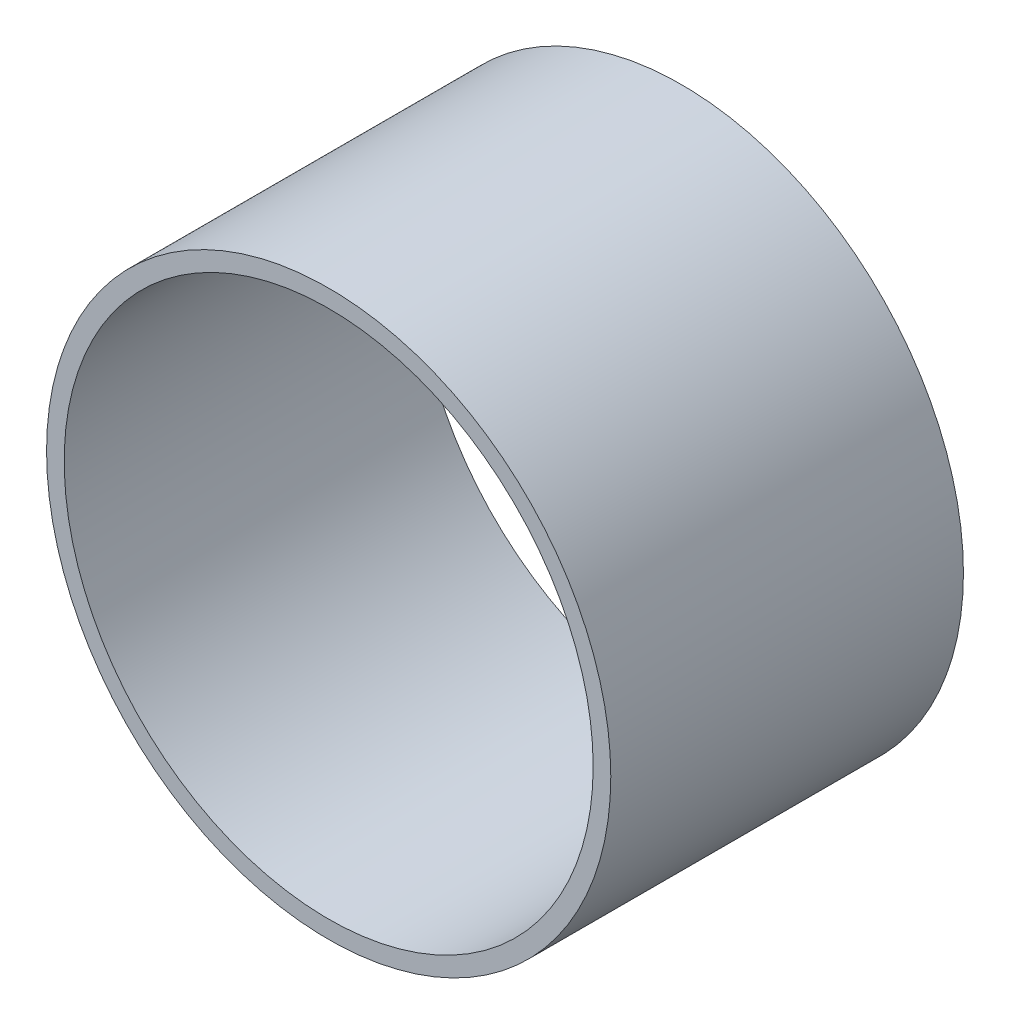
ISO-10303-21;
HEADER;
FILE_DESCRIPTION(('STEP AP214'),'2;1');
FILE_NAME('part.step','',(''),(''),'','','');
FILE_SCHEMA(('AUTOMOTIVE_DESIGN { 1 0 10303 214 1 1 1 1 }'));
ENDSEC;
DATA;
#1=APPLICATION_CONTEXT('core data for automotive mechanical design processes');
#2=APPLICATION_PROTOCOL_DEFINITION('international standard','automotive_design',2000,#1);
#3=PRODUCT_CONTEXT('',#1,'mechanical');
#4=PRODUCT('Part','Part','',(#3));
#5=PRODUCT_RELATED_PRODUCT_CATEGORY('part','',(#4));
#6=PRODUCT_DEFINITION_FORMATION('','',#4);
#7=PRODUCT_DEFINITION_CONTEXT('part definition',#1,'design');
#8=PRODUCT_DEFINITION('design','',#6,#7);
#9=PRODUCT_DEFINITION_SHAPE('','',#8);
#10=(LENGTH_UNIT() NAMED_UNIT(*) SI_UNIT(.MILLI.,.METRE.));
#11=(NAMED_UNIT(*) PLANE_ANGLE_UNIT() SI_UNIT($,.RADIAN.));
#12=(NAMED_UNIT(*) SI_UNIT($,.STERADIAN.) SOLID_ANGLE_UNIT());
#13=UNCERTAINTY_MEASURE_WITH_UNIT(LENGTH_MEASURE(1.E-05),#10,'distance_accuracy_value','');
#14=(GEOMETRIC_REPRESENTATION_CONTEXT(3) GLOBAL_UNCERTAINTY_ASSIGNED_CONTEXT((#13)) GLOBAL_UNIT_ASSIGNED_CONTEXT((#10,
#11,#12)) REPRESENTATION_CONTEXT('',''));
#15=CARTESIAN_POINT('',(0.,0.,0.));
#16=DIRECTION('',(0.,0.,1.));
#17=DIRECTION('',(1.,0.,0.));
#18=AXIS2_PLACEMENT_3D('',#15,#16,#17);
#19=CARTESIAN_POINT('',(0.,0.,-136.));
#20=DIRECTION('',(0.,0.,1.));
#21=DIRECTION('',(1.,0.,0.));
#22=AXIS2_PLACEMENT_3D('',#19,#20,#21);
#23=CYLINDRICAL_SURFACE('',#22,45.);
#24=CARTESIAN_POINT('',(0.,0.,-201.));
#25=DIRECTION('',(0.,0.,1.));
#26=DIRECTION('',(1.,0.,0.));
#27=AXIS2_PLACEMENT_3D('',#24,#25,#26);
#28=CIRCLE('',#27,45.);
#29=CARTESIAN_POINT('',(45.,0.,-201.));
#30=VERTEX_POINT('',#29);
#31=EDGE_CURVE('E10',#30,#30,#28,.T.);
#32=ORIENTED_EDGE('',*,*,#31,.F.);
#33=EDGE_LOOP('',(#32));
#34=FACE_BOUND('',#33,.T.);
#35=CARTESIAN_POINT('',(0.,0.,-141.));
#36=DIRECTION('',(0.,0.,1.));
#37=DIRECTION('',(1.,0.,0.));
#38=AXIS2_PLACEMENT_3D('',#35,#36,#37);
#39=CIRCLE('',#38,45.);
#40=CARTESIAN_POINT('',(45.,0.,-141.));
#41=VERTEX_POINT('',#40);
#42=EDGE_CURVE('E53',#41,#41,#39,.T.);
#43=ORIENTED_EDGE('',*,*,#42,.T.);
#44=EDGE_LOOP('',(#43));
#45=FACE_BOUND('',#44,.T.);
#46=ADVANCED_FACE('F39',(#34,#45),#23,.F.);
#47=CARTESIAN_POINT('',(0.,45.,-201.));
#48=DIRECTION('',(0.,0.,1.));
#49=DIRECTION('',(1.,0.,0.));
#50=AXIS2_PLACEMENT_3D('',#47,#48,#49);
#51=PLANE('',#50);
#52=CARTESIAN_POINT('',(0.,0.,-201.));
#53=DIRECTION('',(0.,0.,1.));
#54=DIRECTION('',(1.,0.,0.));
#55=AXIS2_PLACEMENT_3D('',#52,#53,#54);
#56=CIRCLE('',#55,48.);
#57=CARTESIAN_POINT('',(48.,0.,-201.));
#58=VERTEX_POINT('',#57);
#59=EDGE_CURVE('E45',#58,#58,#56,.T.);
#60=ORIENTED_EDGE('',*,*,#59,.F.);
#61=EDGE_LOOP('',(#60));
#62=FACE_BOUND('',#61,.T.);
#63=ORIENTED_EDGE('',*,*,#31,.T.);
#64=EDGE_LOOP('',(#63));
#65=FACE_BOUND('',#64,.T.);
#66=ADVANCED_FACE('F68',(#62,#65),#51,.F.);
#67=CARTESIAN_POINT('',(0.,0.,-136.));
#68=DIRECTION('',(0.,0.,1.));
#69=DIRECTION('',(1.,0.,0.));
#70=AXIS2_PLACEMENT_3D('',#67,#68,#69);
#71=CYLINDRICAL_SURFACE('',#70,48.);
#72=CARTESIAN_POINT('',(0.,0.,-141.));
#73=DIRECTION('',(0.,0.,1.));
#74=DIRECTION('',(1.,0.,0.));
#75=AXIS2_PLACEMENT_3D('',#72,#73,#74);
#76=CIRCLE('',#75,48.);
#77=CARTESIAN_POINT('',(48.,0.,-141.));
#78=VERTEX_POINT('',#77);
#79=EDGE_CURVE('E49',#78,#78,#76,.T.);
#80=ORIENTED_EDGE('',*,*,#79,.F.);
#81=EDGE_LOOP('',(#80));
#82=FACE_BOUND('',#81,.T.);
#83=ORIENTED_EDGE('',*,*,#59,.T.);
#84=EDGE_LOOP('',(#83));
#85=FACE_BOUND('',#84,.T.);
#86=ADVANCED_FACE('F63',(#82,#85),#71,.T.);
#87=CARTESIAN_POINT('',(0.,48.,-141.));
#88=DIRECTION('',(0.,0.,-1.));
#89=DIRECTION('',(-1.,0.,0.));
#90=AXIS2_PLACEMENT_3D('',#87,#88,#89);
#91=PLANE('',#90);
#92=ORIENTED_EDGE('',*,*,#42,.F.);
#93=EDGE_LOOP('',(#92));
#94=FACE_BOUND('',#93,.T.);
#95=ORIENTED_EDGE('',*,*,#79,.T.);
#96=EDGE_LOOP('',(#95));
#97=FACE_BOUND('',#96,.T.);
#98=ADVANCED_FACE('F60',(#94,#97),#91,.F.);
#99=CLOSED_SHELL('',(#46,#66,#86,#98));
#100=MANIFOLD_SOLID_BREP('B2',#99);
#101=ADVANCED_BREP_SHAPE_REPRESENTATION('',(#18,#100),#14);
#102=SHAPE_DEFINITION_REPRESENTATION(#9,#101);
ENDSEC;
END-ISO-10303-21;
